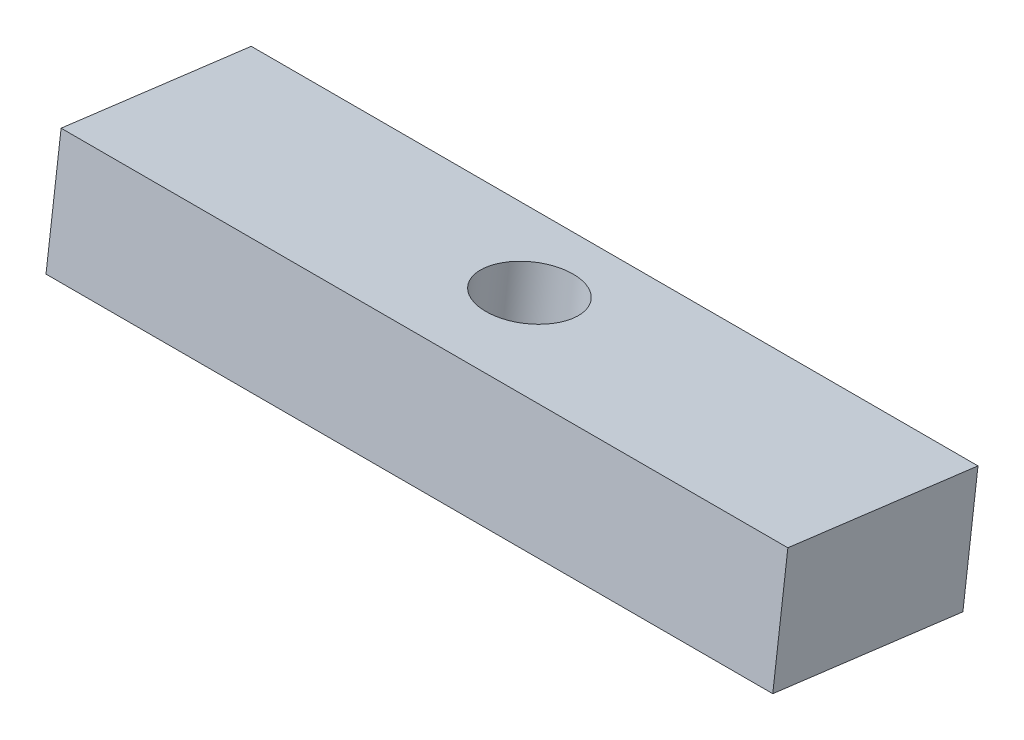
ISO-10303-21;
HEADER;
FILE_DESCRIPTION(('STEP AP214'),'2;1');
FILE_NAME('part.step','',(''),(''),'','','');
FILE_SCHEMA(('AUTOMOTIVE_DESIGN { 1 0 10303 214 1 1 1 1 }'));
ENDSEC;
DATA;
#1=APPLICATION_CONTEXT('core data for automotive mechanical design processes');
#2=APPLICATION_PROTOCOL_DEFINITION('international standard','automotive_design',2000,#1);
#3=PRODUCT_CONTEXT('',#1,'mechanical');
#4=PRODUCT('Part','Part','',(#3));
#5=PRODUCT_RELATED_PRODUCT_CATEGORY('part','',(#4));
#6=PRODUCT_DEFINITION_FORMATION('','',#4);
#7=PRODUCT_DEFINITION_CONTEXT('part definition',#1,'design');
#8=PRODUCT_DEFINITION('design','',#6,#7);
#9=PRODUCT_DEFINITION_SHAPE('','',#8);
#10=(LENGTH_UNIT() NAMED_UNIT(*) SI_UNIT(.MILLI.,.METRE.));
#11=(NAMED_UNIT(*) PLANE_ANGLE_UNIT() SI_UNIT($,.RADIAN.));
#12=(NAMED_UNIT(*) SI_UNIT($,.STERADIAN.) SOLID_ANGLE_UNIT());
#13=UNCERTAINTY_MEASURE_WITH_UNIT(LENGTH_MEASURE(1.E-05),#10,'distance_accuracy_value','');
#14=(GEOMETRIC_REPRESENTATION_CONTEXT(3) GLOBAL_UNCERTAINTY_ASSIGNED_CONTEXT((#13)) GLOBAL_UNIT_ASSIGNED_CONTEXT((#10,
#11,#12)) REPRESENTATION_CONTEXT('',''));
#15=CARTESIAN_POINT('',(0.,0.,0.));
#16=DIRECTION('',(0.,0.,1.));
#17=DIRECTION('',(1.,0.,0.));
#18=AXIS2_PLACEMENT_3D('',#15,#16,#17);
#19=CARTESIAN_POINT('',(0.,181.746988025736,-23.0836511449948));
#20=DIRECTION('',(0.,0.992030544404552,-0.12599761493143));
#21=DIRECTION('',(0.,0.12599761493143,0.992030544404552));
#22=AXIS2_PLACEMENT_3D('',#19,#20,#21);
#23=PLANE('',#22);
#24=DIRECTION('',(0.,0.12599761493143,0.992030544404552));
#25=VECTOR('',#24,1.);
#26=CARTESIAN_POINT('',(2.54999999999997,168.365612908857,-128.440668016326));
#27=LINE('',#26,#25);
#28=CARTESIAN_POINT('',(2.54999999999997,167.760824357186,-133.202414629468));
#29=VERTEX_POINT('',#28);
#30=CARTESIAN_POINT('',(2.54999999999997,168.365612908857,-128.440668016326));
#31=VERTEX_POINT('',#30);
#32=EDGE_CURVE('E90',#29,#31,#27,.T.);
#33=ORIENTED_EDGE('',*,*,#32,.T.);
#34=DIRECTION('',(-1.,0.,0.));
#35=VECTOR('',#34,1.);
#36=CARTESIAN_POINT('',(2.54999999999997,168.365612908857,-128.440668016326));
#37=LINE('',#36,#35);
#38=CARTESIAN_POINT('',(-15.6500000000001,168.365612908857,-128.440668016326));
#39=VERTEX_POINT('',#38);
#40=EDGE_CURVE('E84',#31,#39,#37,.T.);
#41=ORIENTED_EDGE('',*,*,#40,.T.);
#42=DIRECTION('',(0.,-0.125997614931425,-0.992030544404552));
#43=VECTOR('',#42,1.);
#44=CARTESIAN_POINT('',(-15.6500000000001,168.365612908857,-128.440668016326));
#45=LINE('',#44,#43);
#46=CARTESIAN_POINT('',(-15.6500000000001,167.760824357186,-133.202414629468));
#47=VERTEX_POINT('',#46);
#48=EDGE_CURVE('E87',#39,#47,#45,.T.);
#49=ORIENTED_EDGE('',*,*,#48,.T.);
#50=DIRECTION('',(1.,0.,0.));
#51=VECTOR('',#50,1.);
#52=CARTESIAN_POINT('',(-7.10000000000002,167.760824357186,-133.202414629468));
#53=LINE('',#52,#51);
#54=EDGE_CURVE('E56',#47,#29,#53,.T.);
#55=ORIENTED_EDGE('',*,*,#54,.T.);
#56=EDGE_LOOP('',(#33,#41,#49,#55));
#57=FACE_BOUND('',#56,.T.);
#58=CARTESIAN_POINT('',(-6.55000000000002,168.031719229289,-131.069548958998));
#59=DIRECTION('',(0.,-0.992030544404552,0.125997614931428));
#60=DIRECTION('',(0.,-0.125997614931428,-0.992030544404552));
#61=AXIS2_PLACEMENT_3D('',#58,#59,#60);
#62=CIRCLE('',#61,1.10000000000002);
#63=CARTESIAN_POINT('',(-6.55000000000002,167.893121852864,-132.160782557843));
#64=VERTEX_POINT('',#63);
#65=EDGE_CURVE('E107',#64,#64,#62,.T.);
#66=ORIENTED_EDGE('',*,*,#65,.F.);
#67=EDGE_LOOP('',(#66));
#68=FACE_BOUND('',#67,.T.);
#69=ADVANCED_FACE('F39',(#57,#68),#23,.F.);
#70=CARTESIAN_POINT('',(0.,184.723079658949,-23.4616439897891));
#71=DIRECTION('',(0.,0.992030544404552,-0.12599761493143));
#72=DIRECTION('',(0.,0.12599761493143,0.992030544404552));
#73=AXIS2_PLACEMENT_3D('',#70,#71,#72);
#74=PLANE('',#73);
#75=DIRECTION('',(0.,0.12599761493143,0.992030544404552));
#76=VECTOR('',#75,1.);
#77=CARTESIAN_POINT('',(2.54999999999996,171.341704542071,-128.81866086112));
#78=LINE('',#77,#76);
#79=CARTESIAN_POINT('',(2.54999999999996,170.7369159904,-133.580407474262));
#80=VERTEX_POINT('',#79);
#81=CARTESIAN_POINT('',(2.54999999999996,171.341704542071,-128.81866086112));
#82=VERTEX_POINT('',#81);
#83=EDGE_CURVE('E104',#80,#82,#78,.T.);
#84=ORIENTED_EDGE('',*,*,#83,.F.);
#85=DIRECTION('',(1.,0.,0.));
#86=VECTOR('',#85,1.);
#87=CARTESIAN_POINT('',(2.54999999999996,170.7369159904,-133.580407474262));
#88=LINE('',#87,#86);
#89=CARTESIAN_POINT('',(-15.6500000000001,170.7369159904,-133.580407474262));
#90=VERTEX_POINT('',#89);
#91=EDGE_CURVE('E73',#90,#80,#88,.T.);
#92=ORIENTED_EDGE('',*,*,#91,.F.);
#93=DIRECTION('',(0.,-0.125997614931425,-0.992030544404552));
#94=VECTOR('',#93,1.);
#95=CARTESIAN_POINT('',(-15.6500000000001,171.341704542071,-128.81866086112));
#96=LINE('',#95,#94);
#97=CARTESIAN_POINT('',(-15.6500000000001,171.341704542071,-128.81866086112));
#98=VERTEX_POINT('',#97);
#99=EDGE_CURVE('E109',#98,#90,#96,.T.);
#100=ORIENTED_EDGE('',*,*,#99,.F.);
#101=DIRECTION('',(-1.,0.,0.));
#102=VECTOR('',#101,1.);
#103=CARTESIAN_POINT('',(2.54999999999996,171.341704542071,-128.81866086112));
#104=LINE('',#103,#102);
#105=EDGE_CURVE('E95',#82,#98,#104,.T.);
#106=ORIENTED_EDGE('',*,*,#105,.F.);
#107=EDGE_LOOP('',(#84,#92,#100,#106));
#108=FACE_BOUND('',#107,.T.);
#109=CARTESIAN_POINT('',(-6.55000000000002,171.007810862503,-131.447541803792));
#110=DIRECTION('',(0.,-0.992030544404552,0.125997614931428));
#111=DIRECTION('',(0.,-0.125997614931428,-0.992030544404552));
#112=AXIS2_PLACEMENT_3D('',#109,#110,#111);
#113=CIRCLE('',#112,1.10000000000002);
#114=CARTESIAN_POINT('',(-6.55000000000002,170.869213486078,-132.538775402637));
#115=VERTEX_POINT('',#114);
#116=EDGE_CURVE('E116',#115,#115,#113,.T.);
#117=ORIENTED_EDGE('',*,*,#116,.T.);
#118=EDGE_LOOP('',(#117));
#119=FACE_BOUND('',#118,.T.);
#120=ADVANCED_FACE('F125',(#108,#119),#74,.T.);
#121=CARTESIAN_POINT('',(2.54999999999997,168.365612908857,-128.440668016326));
#122=DIRECTION('',(-1.,0.,0.));
#123=DIRECTION('',(0.,-1.,0.));
#124=AXIS2_PLACEMENT_3D('',#121,#122,#123);
#125=PLANE('',#124);
#126=ORIENTED_EDGE('',*,*,#83,.T.);
#127=DIRECTION('',(0.,0.992030544404552,-0.125997614931428));
#128=VECTOR('',#127,1.);
#129=CARTESIAN_POINT('',(2.54999999999997,168.365612908857,-128.440668016326));
#130=LINE('',#129,#128);
#131=EDGE_CURVE('E11',#31,#82,#130,.T.);
#132=ORIENTED_EDGE('',*,*,#131,.F.);
#133=ORIENTED_EDGE('',*,*,#32,.F.);
#134=DIRECTION('',(0.,0.992030544404552,-0.125997614931428));
#135=VECTOR('',#134,1.);
#136=CARTESIAN_POINT('',(2.54999999999997,167.760824357186,-133.202414629468));
#137=LINE('',#136,#135);
#138=EDGE_CURVE('E100',#29,#80,#137,.T.);
#139=ORIENTED_EDGE('',*,*,#138,.T.);
#140=EDGE_LOOP('',(#126,#132,#133,#139));
#141=FACE_BOUND('',#140,.T.);
#142=ADVANCED_FACE('F41',(#141),#125,.F.);
#143=CARTESIAN_POINT('',(2.54999999999997,168.365612908857,-128.440668016326));
#144=DIRECTION('',(0.,-0.125997614931428,-0.992030544404552));
#145=DIRECTION('',(0.,0.992030544404552,-0.125997614931428));
#146=AXIS2_PLACEMENT_3D('',#143,#144,#145);
#147=PLANE('',#146);
#148=ORIENTED_EDGE('',*,*,#105,.T.);
#149=DIRECTION('',(0.,0.992030544404552,-0.125997614931428));
#150=VECTOR('',#149,1.);
#151=CARTESIAN_POINT('',(-15.6500000000001,168.365612908857,-128.440668016326));
#152=LINE('',#151,#150);
#153=EDGE_CURVE('E48',#39,#98,#152,.T.);
#154=ORIENTED_EDGE('',*,*,#153,.F.);
#155=ORIENTED_EDGE('',*,*,#40,.F.);
#156=ORIENTED_EDGE('',*,*,#131,.T.);
#157=EDGE_LOOP('',(#148,#154,#155,#156));
#158=FACE_BOUND('',#157,.T.);
#159=ADVANCED_FACE('F94',(#158),#147,.F.);
#160=CARTESIAN_POINT('',(-15.6500000000001,168.365612908857,-128.440668016326));
#161=DIRECTION('',(1.,0.,0.));
#162=DIRECTION('',(0.,1.,0.));
#163=AXIS2_PLACEMENT_3D('',#160,#161,#162);
#164=PLANE('',#163);
#165=ORIENTED_EDGE('',*,*,#99,.T.);
#166=DIRECTION('',(0.,0.992030544404552,-0.125997614931428));
#167=VECTOR('',#166,1.);
#168=CARTESIAN_POINT('',(-15.6500000000001,167.760824357186,-133.202414629468));
#169=LINE('',#168,#167);
#170=EDGE_CURVE('E97',#47,#90,#169,.T.);
#171=ORIENTED_EDGE('',*,*,#170,.F.);
#172=ORIENTED_EDGE('',*,*,#48,.F.);
#173=ORIENTED_EDGE('',*,*,#153,.T.);
#174=EDGE_LOOP('',(#165,#171,#172,#173));
#175=FACE_BOUND('',#174,.T.);
#176=ADVANCED_FACE('F98',(#175),#164,.F.);
#177=CARTESIAN_POINT('',(2.54999999999997,167.760824357186,-133.202414629468));
#178=DIRECTION('',(0.,0.125997614931428,0.992030544404552));
#179=DIRECTION('',(0.,-0.992030544404552,0.125997614931428));
#180=AXIS2_PLACEMENT_3D('',#177,#178,#179);
#181=PLANE('',#180);
#182=ORIENTED_EDGE('',*,*,#91,.T.);
#183=ORIENTED_EDGE('',*,*,#138,.F.);
#184=ORIENTED_EDGE('',*,*,#54,.F.);
#185=ORIENTED_EDGE('',*,*,#170,.T.);
#186=EDGE_LOOP('',(#182,#183,#184,#185));
#187=FACE_BOUND('',#186,.T.);
#188=ADVANCED_FACE('F113',(#187),#181,.F.);
#189=CARTESIAN_POINT('',(-6.55000000000002,168.031719229289,-131.069548958998));
#190=DIRECTION('',(0.,0.992030544404552,-0.125997614931428));
#191=DIRECTION('',(0.,0.125997614931428,0.992030544404552));
#192=AXIS2_PLACEMENT_3D('',#189,#190,#191);
#193=CYLINDRICAL_SURFACE('',#192,1.10000000000002);
#194=ORIENTED_EDGE('',*,*,#65,.T.);
#195=EDGE_LOOP('',(#194));
#196=FACE_BOUND('',#195,.T.);
#197=ORIENTED_EDGE('',*,*,#116,.F.);
#198=EDGE_LOOP('',(#197));
#199=FACE_BOUND('',#198,.T.);
#200=ADVANCED_FACE('F122',(#196,#199),#193,.F.);
#201=CLOSED_SHELL('',(#69,#120,#142,#159,#176,#188,#200));
#202=MANIFOLD_SOLID_BREP('B2',#201);
#203=ADVANCED_BREP_SHAPE_REPRESENTATION('',(#18,#202),#14);
#204=SHAPE_DEFINITION_REPRESENTATION(#9,#203);
ENDSEC;
END-ISO-10303-21;
